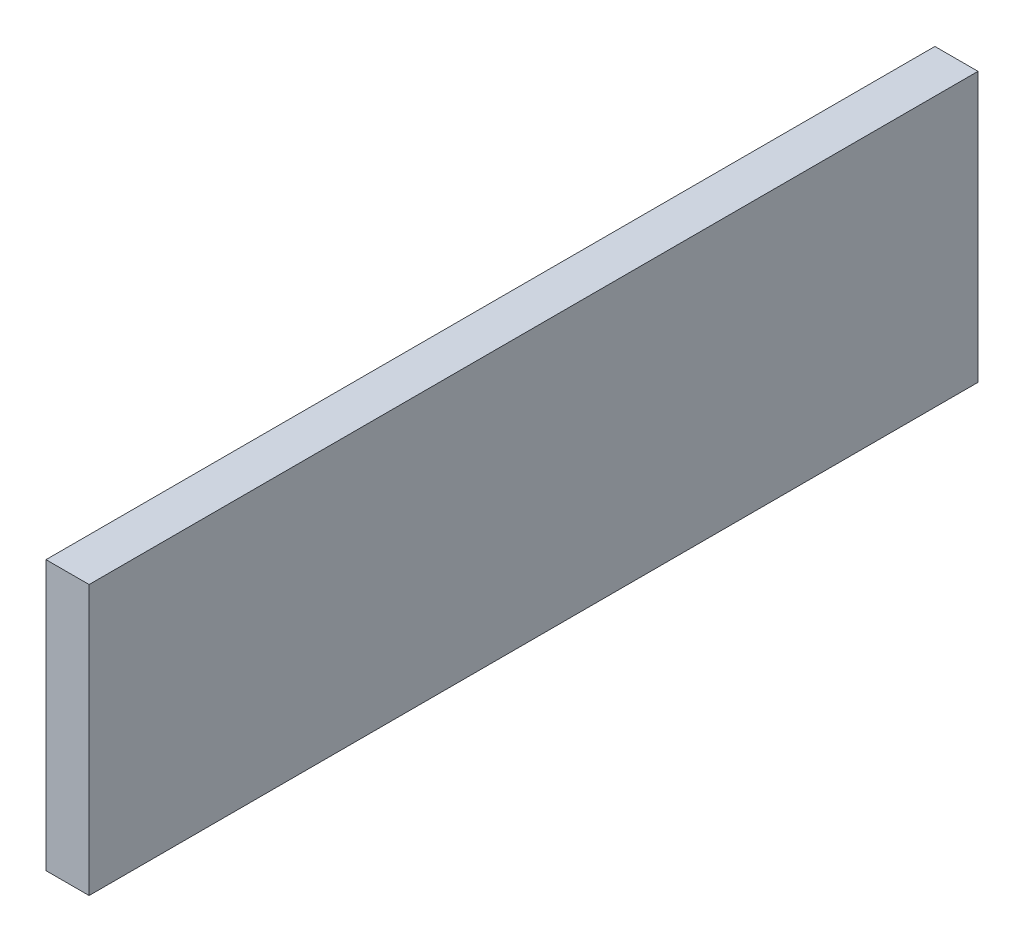
ISO-10303-21;
HEADER;
FILE_DESCRIPTION(('STEP AP214'),'2;1');
FILE_NAME('part.step','',(''),(''),'','','');
FILE_SCHEMA(('AUTOMOTIVE_DESIGN { 1 0 10303 214 1 1 1 1 }'));
ENDSEC;
DATA;
#1=APPLICATION_CONTEXT('core data for automotive mechanical design processes');
#2=APPLICATION_PROTOCOL_DEFINITION('international standard','automotive_design',2000,#1);
#3=PRODUCT_CONTEXT('',#1,'mechanical');
#4=PRODUCT('Part','Part','',(#3));
#5=PRODUCT_RELATED_PRODUCT_CATEGORY('part','',(#4));
#6=PRODUCT_DEFINITION_FORMATION('','',#4);
#7=PRODUCT_DEFINITION_CONTEXT('part definition',#1,'design');
#8=PRODUCT_DEFINITION('design','',#6,#7);
#9=PRODUCT_DEFINITION_SHAPE('','',#8);
#10=(LENGTH_UNIT() NAMED_UNIT(*) SI_UNIT(.MILLI.,.METRE.));
#11=(NAMED_UNIT(*) PLANE_ANGLE_UNIT() SI_UNIT($,.RADIAN.));
#12=(NAMED_UNIT(*) SI_UNIT($,.STERADIAN.) SOLID_ANGLE_UNIT());
#13=UNCERTAINTY_MEASURE_WITH_UNIT(LENGTH_MEASURE(1.E-05),#10,'distance_accuracy_value','');
#14=(GEOMETRIC_REPRESENTATION_CONTEXT(3) GLOBAL_UNCERTAINTY_ASSIGNED_CONTEXT((#13)) GLOBAL_UNIT_ASSIGNED_CONTEXT((#10,
#11,#12)) REPRESENTATION_CONTEXT('',''));
#15=CARTESIAN_POINT('',(0.,0.,0.));
#16=DIRECTION('',(0.,0.,1.));
#17=DIRECTION('',(1.,0.,0.));
#18=AXIS2_PLACEMENT_3D('',#15,#16,#17);
#19=CARTESIAN_POINT('',(4.,-12.5,70.));
#20=DIRECTION('',(0.,1.,0.));
#21=DIRECTION('',(0.,0.,1.));
#22=AXIS2_PLACEMENT_3D('',#19,#20,#21);
#23=PLANE('',#22);
#24=DIRECTION('',(0.,0.,-1.));
#25=VECTOR('',#24,1.);
#26=CARTESIAN_POINT('',(0.,-12.5,70.));
#27=LINE('',#26,#25);
#28=CARTESIAN_POINT('',(0.,-12.5,70.));
#29=VERTEX_POINT('',#28);
#30=CARTESIAN_POINT('',(0.,-12.5,-12.5));
#31=VERTEX_POINT('',#30);
#32=EDGE_CURVE('E96',#29,#31,#27,.T.);
#33=ORIENTED_EDGE('',*,*,#32,.T.);
#34=DIRECTION('',(-1.,0.,0.));
#35=VECTOR('',#34,1.);
#36=CARTESIAN_POINT('',(4.,-12.5,-12.5));
#37=LINE('',#36,#35);
#38=CARTESIAN_POINT('',(4.,-12.5,-12.5));
#39=VERTEX_POINT('',#38);
#40=EDGE_CURVE('E11',#39,#31,#37,.T.);
#41=ORIENTED_EDGE('',*,*,#40,.F.);
#42=DIRECTION('',(0.,0.,-1.));
#43=VECTOR('',#42,1.);
#44=CARTESIAN_POINT('',(4.,-12.5,70.));
#45=LINE('',#44,#43);
#46=CARTESIAN_POINT('',(4.,-12.5,70.));
#47=VERTEX_POINT('',#46);
#48=EDGE_CURVE('E84',#47,#39,#45,.T.);
#49=ORIENTED_EDGE('',*,*,#48,.F.);
#50=DIRECTION('',(-1.,0.,0.));
#51=VECTOR('',#50,1.);
#52=CARTESIAN_POINT('',(4.,-12.5,70.));
#53=LINE('',#52,#51);
#54=EDGE_CURVE('E92',#47,#29,#53,.T.);
#55=ORIENTED_EDGE('',*,*,#54,.T.);
#56=EDGE_LOOP('',(#33,#41,#49,#55));
#57=FACE_BOUND('',#56,.T.);
#58=ADVANCED_FACE('F33',(#57),#23,.F.);
#59=CARTESIAN_POINT('',(4.,12.5,-12.5));
#60=DIRECTION('',(0.,0.,1.));
#61=DIRECTION('',(1.,0.,0.));
#62=AXIS2_PLACEMENT_3D('',#59,#60,#61);
#63=PLANE('',#62);
#64=DIRECTION('',(0.,1.,0.));
#65=VECTOR('',#64,1.);
#66=CARTESIAN_POINT('',(0.,12.5,-12.5));
#67=LINE('',#66,#65);
#68=CARTESIAN_POINT('',(0.,12.5,-12.5));
#69=VERTEX_POINT('',#68);
#70=EDGE_CURVE('E88',#31,#69,#67,.T.);
#71=ORIENTED_EDGE('',*,*,#70,.T.);
#72=DIRECTION('',(-1.,0.,0.));
#73=VECTOR('',#72,1.);
#74=CARTESIAN_POINT('',(4.,12.5,-12.5));
#75=LINE('',#74,#73);
#76=CARTESIAN_POINT('',(4.,12.5,-12.5));
#77=VERTEX_POINT('',#76);
#78=EDGE_CURVE('E41',#77,#69,#75,.T.);
#79=ORIENTED_EDGE('',*,*,#78,.F.);
#80=DIRECTION('',(0.,1.,0.));
#81=VECTOR('',#80,1.);
#82=CARTESIAN_POINT('',(4.,12.5,-12.5));
#83=LINE('',#82,#81);
#84=EDGE_CURVE('E79',#39,#77,#83,.T.);
#85=ORIENTED_EDGE('',*,*,#84,.F.);
#86=ORIENTED_EDGE('',*,*,#40,.T.);
#87=EDGE_LOOP('',(#71,#79,#85,#86));
#88=FACE_BOUND('',#87,.T.);
#89=ADVANCED_FACE('F87',(#88),#63,.F.);
#90=CARTESIAN_POINT('',(4.,12.5,70.));
#91=DIRECTION('',(0.,-1.,0.));
#92=DIRECTION('',(0.,0.,-1.));
#93=AXIS2_PLACEMENT_3D('',#90,#91,#92);
#94=PLANE('',#93);
#95=DIRECTION('',(0.,0.,1.));
#96=VECTOR('',#95,1.);
#97=CARTESIAN_POINT('',(0.,12.5,70.));
#98=LINE('',#97,#96);
#99=CARTESIAN_POINT('',(0.,12.5,70.));
#100=VERTEX_POINT('',#99);
#101=EDGE_CURVE('E66',#69,#100,#98,.T.);
#102=ORIENTED_EDGE('',*,*,#101,.T.);
#103=DIRECTION('',(-1.,0.,0.));
#104=VECTOR('',#103,1.);
#105=CARTESIAN_POINT('',(4.,12.5,70.));
#106=LINE('',#105,#104);
#107=CARTESIAN_POINT('',(4.,12.5,70.));
#108=VERTEX_POINT('',#107);
#109=EDGE_CURVE('E89',#108,#100,#106,.T.);
#110=ORIENTED_EDGE('',*,*,#109,.F.);
#111=DIRECTION('',(0.,0.,1.));
#112=VECTOR('',#111,1.);
#113=CARTESIAN_POINT('',(4.,12.5,70.));
#114=LINE('',#113,#112);
#115=EDGE_CURVE('E82',#77,#108,#114,.T.);
#116=ORIENTED_EDGE('',*,*,#115,.F.);
#117=ORIENTED_EDGE('',*,*,#78,.T.);
#118=EDGE_LOOP('',(#102,#110,#116,#117));
#119=FACE_BOUND('',#118,.T.);
#120=ADVANCED_FACE('F90',(#119),#94,.F.);
#121=CARTESIAN_POINT('',(4.,12.5,70.));
#122=DIRECTION('',(0.,0.,-1.));
#123=DIRECTION('',(-1.,0.,0.));
#124=AXIS2_PLACEMENT_3D('',#121,#122,#123);
#125=PLANE('',#124);
#126=DIRECTION('',(0.,-1.,0.));
#127=VECTOR('',#126,1.);
#128=CARTESIAN_POINT('',(0.,12.5,70.));
#129=LINE('',#128,#127);
#130=EDGE_CURVE('E72',#100,#29,#129,.T.);
#131=ORIENTED_EDGE('',*,*,#130,.T.);
#132=ORIENTED_EDGE('',*,*,#54,.F.);
#133=DIRECTION('',(0.,-1.,0.));
#134=VECTOR('',#133,1.);
#135=CARTESIAN_POINT('',(4.,12.5,70.));
#136=LINE('',#135,#134);
#137=EDGE_CURVE('E49',#108,#47,#136,.T.);
#138=ORIENTED_EDGE('',*,*,#137,.F.);
#139=ORIENTED_EDGE('',*,*,#109,.T.);
#140=EDGE_LOOP('',(#131,#132,#138,#139));
#141=FACE_BOUND('',#140,.T.);
#142=ADVANCED_FACE('F103',(#141),#125,.F.);
#143=CARTESIAN_POINT('',(4.,0.,0.));
#144=DIRECTION('',(-1.,0.,0.));
#145=DIRECTION('',(0.,0.,1.));
#146=AXIS2_PLACEMENT_3D('',#143,#144,#145);
#147=PLANE('',#146);
#148=ORIENTED_EDGE('',*,*,#48,.T.);
#149=ORIENTED_EDGE('',*,*,#84,.T.);
#150=ORIENTED_EDGE('',*,*,#115,.T.);
#151=ORIENTED_EDGE('',*,*,#137,.T.);
#152=EDGE_LOOP('',(#148,#149,#150,#151));
#153=FACE_BOUND('',#152,.T.);
#154=ADVANCED_FACE('F80',(#153),#147,.F.);
#155=CARTESIAN_POINT('',(0.,0.,0.));
#156=DIRECTION('',(-1.,0.,0.));
#157=DIRECTION('',(0.,0.,1.));
#158=AXIS2_PLACEMENT_3D('',#155,#156,#157);
#159=PLANE('',#158);
#160=ORIENTED_EDGE('',*,*,#32,.F.);
#161=ORIENTED_EDGE('',*,*,#130,.F.);
#162=ORIENTED_EDGE('',*,*,#101,.F.);
#163=ORIENTED_EDGE('',*,*,#70,.F.);
#164=EDGE_LOOP('',(#160,#161,#162,#163));
#165=FACE_BOUND('',#164,.T.);
#166=ADVANCED_FACE('F106',(#165),#159,.T.);
#167=CLOSED_SHELL('',(#58,#89,#120,#142,#154,#166));
#168=MANIFOLD_SOLID_BREP('B2',#167);
#169=ADVANCED_BREP_SHAPE_REPRESENTATION('',(#18,#168),#14);
#170=SHAPE_DEFINITION_REPRESENTATION(#9,#169);
ENDSEC;
END-ISO-10303-21;
